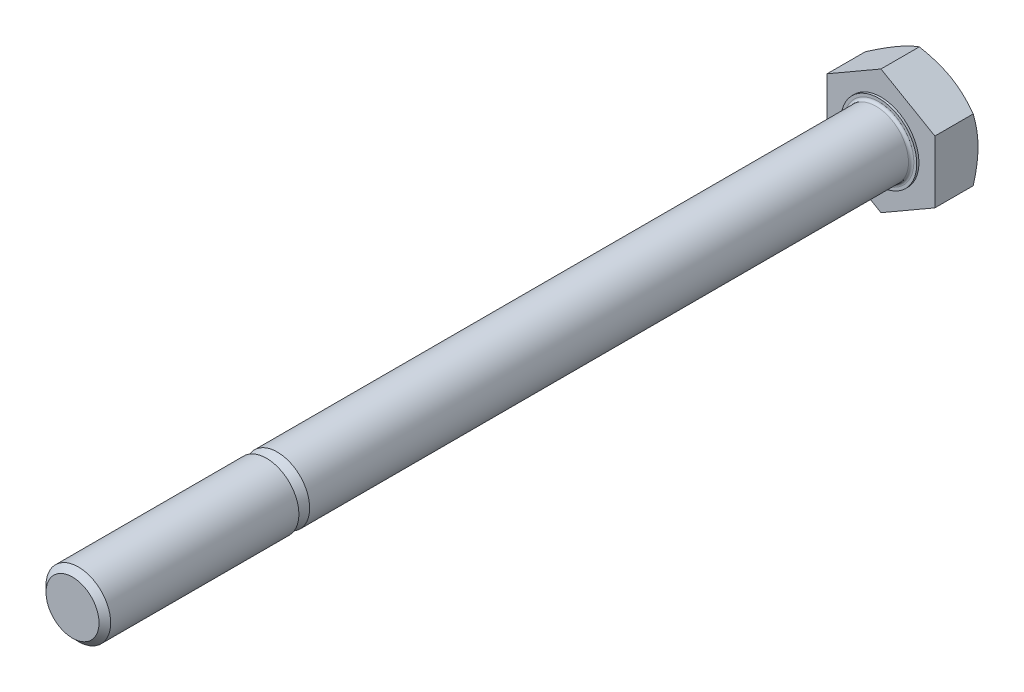
ISO-10303-21;
HEADER;
FILE_DESCRIPTION(('STEP AP214'),'2;1');
FILE_NAME('part.step','',(''),(''),'','','');
FILE_SCHEMA(('AUTOMOTIVE_DESIGN { 1 0 10303 214 1 1 1 1 }'));
ENDSEC;
DATA;
#1=APPLICATION_CONTEXT('core data for automotive mechanical design processes');
#2=APPLICATION_PROTOCOL_DEFINITION('international standard','automotive_design',2000,#1);
#3=PRODUCT_CONTEXT('',#1,'mechanical');
#4=PRODUCT('Part','Part','',(#3));
#5=PRODUCT_RELATED_PRODUCT_CATEGORY('part','',(#4));
#6=PRODUCT_DEFINITION_FORMATION('','',#4);
#7=PRODUCT_DEFINITION_CONTEXT('part definition',#1,'design');
#8=PRODUCT_DEFINITION('design','',#6,#7);
#9=PRODUCT_DEFINITION_SHAPE('','',#8);
#10=(LENGTH_UNIT() NAMED_UNIT(*) SI_UNIT(.MILLI.,.METRE.));
#11=(NAMED_UNIT(*) PLANE_ANGLE_UNIT() SI_UNIT($,.RADIAN.));
#12=(NAMED_UNIT(*) SI_UNIT($,.STERADIAN.) SOLID_ANGLE_UNIT());
#13=UNCERTAINTY_MEASURE_WITH_UNIT(LENGTH_MEASURE(1.E-05),#10,'distance_accuracy_value','');
#14=(GEOMETRIC_REPRESENTATION_CONTEXT(3) GLOBAL_UNCERTAINTY_ASSIGNED_CONTEXT((#13)) GLOBAL_UNIT_ASSIGNED_CONTEXT((#10,
#11,#12)) REPRESENTATION_CONTEXT('',''));
#15=CARTESIAN_POINT('',(0.,0.,0.));
#16=DIRECTION('',(0.,0.,1.));
#17=DIRECTION('',(1.,0.,0.));
#18=AXIS2_PLACEMENT_3D('',#15,#16,#17);
#19=CARTESIAN_POINT('',(5.,-2.88675134594812,-5.));
#20=DIRECTION('',(-0.5,0.866025403784439,0.));
#21=DIRECTION('',(0.866025403784439,0.5,0.));
#22=AXIS2_PLACEMENT_3D('',#19,#20,#21);
#23=PLANE('',#22);
#24=CARTESIAN_POINT('',(5.000002,-2.88675019124759,-3.55341734594793));
#25=CARTESIAN_POINT('',(4.78027074694607,-3.01361208934764,-3.62667401283849));
#26=CARTESIAN_POINT('',(4.5586601198803,-3.14155904453935,-3.69330350087609));
#27=CARTESIAN_POINT('',(4.11160176522467,-3.39966830594325,-3.80960388176341));
#28=CARTESIAN_POINT('',(3.88614609670003,-3.52983519685628,-3.859233638035));
#29=CARTESIAN_POINT('',(3.43799439633442,-3.78857570170015,-3.93647343389728));
#30=CARTESIAN_POINT('',(3.21536814331772,-3.91710902880802,-3.96459799992946));
#31=CARTESIAN_POINT('',(2.8806459561398,-4.11036097367893,-3.98981464288414));
#32=CARTESIAN_POINT('',(2.76899557601673,-4.17482235069811,-3.99539321968897));
#33=CARTESIAN_POINT('',(2.54559174139457,-4.30380461475521,-4.00079886451652));
#34=CARTESIAN_POINT('',(2.43383829018766,-4.36832549989239,-4.00062611028573));
#35=CARTESIAN_POINT('',(2.12769088590962,-4.54507978616402,-3.99223835401767));
#36=CARTESIAN_POINT('',(1.93339845483021,-4.65725457354923,-3.97816111429647));
#37=CARTESIAN_POINT('',(1.54610304420474,-4.88085968312974,-3.93352860367383));
#38=CARTESIAN_POINT('',(1.35310142524446,-4.9922892197905,-3.90295808665975));
#39=CARTESIAN_POINT('',(0.965026180739004,-5.21634456667155,-3.826542206783));
#40=CARTESIAN_POINT('',(0.770001514907567,-5.32894210998795,-3.78037315312653));
#41=CARTESIAN_POINT('',(0.382860131316657,-5.55245829201861,-3.67558875648398));
#42=CARTESIAN_POINT('',(0.190738457644298,-5.66337979203051,-3.61699801824105));
#43=CARTESIAN_POINT('',(-1.9999999993508E-06,-5.7735038465968,-3.55341734594793));
#44=B_SPLINE_CURVE_WITH_KNOTS('',3,(#24,#25,#26,#27,#28,#29,#30,#31,#32,#33,#34,#35,#36,#37,#38,
#39,#40,#41,#42,#43),.UNSPECIFIED.,.F.,.F.,(4,2,2,2,2,2,2,2,2,4),(0.,0.792540187012439,
1.58698486313849,2.36176947896395,2.74878786986339,3.13579429986343,3.80946255620209,
4.48375460996337,5.17299926182492,5.86089121185928),.UNSPECIFIED.);
#45=CARTESIAN_POINT('',(5.,-2.88675134594812,-3.5534180126148));
#46=VERTEX_POINT('',#45);
#47=CARTESIAN_POINT('',(2.5,-4.33012701892219,-4.));
#48=VERTEX_POINT('',#47);
#49=EDGE_CURVE('E131',#46,#48,#44,.T.);
#50=ORIENTED_EDGE('',*,*,#49,.F.);
#51=DIRECTION('',(0.,0.,-1.));
#52=VECTOR('',#51,1.);
#53=CARTESIAN_POINT('',(5.,-2.88675134594812,-2.61479466551195E-09));
#54=LINE('',#53,#52);
#55=CARTESIAN_POINT('',(5.,-2.88675134594812,-2.61479466551195E-09));
#56=VERTEX_POINT('',#55);
#57=EDGE_CURVE('E116',#56,#46,#54,.T.);
#58=ORIENTED_EDGE('',*,*,#57,.F.);
#59=DIRECTION('',(0.866025403784438,0.500000000000001,0.));
#60=VECTOR('',#59,1.);
#61=CARTESIAN_POINT('',(5.,-2.88675134594812,-2.61479466551195E-09));
#62=LINE('',#61,#60);
#63=CARTESIAN_POINT('',(0.,-5.77350269189626,-2.61479466551195E-09));
#64=VERTEX_POINT('',#63);
#65=EDGE_CURVE('E122',#64,#56,#62,.T.);
#66=ORIENTED_EDGE('',*,*,#65,.F.);
#67=DIRECTION('',(0.,0.,-1.));
#68=VECTOR('',#67,1.);
#69=CARTESIAN_POINT('',(0.,-5.77350269189626,-2.61479466551195E-09));
#70=LINE('',#69,#68);
#71=CARTESIAN_POINT('',(0.,-5.77350269189626,-3.55341801261479));
#72=VERTEX_POINT('',#71);
#73=EDGE_CURVE('E239',#64,#72,#70,.T.);
#74=ORIENTED_EDGE('',*,*,#73,.T.);
#75=EDGE_CURVE('E54',#48,#72,#44,.T.);
#76=ORIENTED_EDGE('',*,*,#75,.F.);
#77=EDGE_LOOP('',(#50,#58,#66,#74,#76));
#78=FACE_BOUND('',#77,.T.);
#79=ADVANCED_FACE('F39',(#78),#23,.F.);
#80=CARTESIAN_POINT('',(0.,-5.77350269189626,-5.));
#81=DIRECTION('',(0.5,0.866025403784439,0.));
#82=DIRECTION('',(0.866025403784439,-0.5,0.));
#83=AXIS2_PLACEMENT_3D('',#80,#81,#82);
#84=PLANE('',#83);
#85=CARTESIAN_POINT('',(2.00000000064743E-06,-5.7735038465968,-3.55341734594793));
#86=CARTESIAN_POINT('',(-0.219729253053924,-5.64664194849674,-3.62667401283849));
#87=CARTESIAN_POINT('',(-0.441339880119702,-5.51869499330503,-3.69330350087609));
#88=CARTESIAN_POINT('',(-0.888398234775334,-5.26058573190113,-3.80960388176341));
#89=CARTESIAN_POINT('',(-1.11385390329997,-5.13041884098811,-3.85923363803499));
#90=CARTESIAN_POINT('',(-1.56200560366558,-4.87167833614423,-3.93647343389728));
#91=CARTESIAN_POINT('',(-1.78463185668228,-4.74314500903636,-3.96459799992946));
#92=CARTESIAN_POINT('',(-2.1193540438602,-4.54989306416545,-3.98981464288413));
#93=CARTESIAN_POINT('',(-2.23100442398327,-4.48543168714627,-3.99539321968897));
#94=CARTESIAN_POINT('',(-2.45440825860543,-4.35644942308917,-4.00079886451652));
#95=CARTESIAN_POINT('',(-2.56616170981234,-4.291928537952,-4.00062611028572));
#96=CARTESIAN_POINT('',(-2.87230911409038,-4.11517425168036,-3.99223835401768));
#97=CARTESIAN_POINT('',(-3.06660154516979,-4.00299946429516,-3.97816111429647));
#98=CARTESIAN_POINT('',(-3.45389695579525,-3.77939435471464,-3.93352860367382));
#99=CARTESIAN_POINT('',(-3.64689857475554,-3.66796481805389,-3.90295808665975));
#100=CARTESIAN_POINT('',(-4.03497381926099,-3.44390947117283,-3.826542206783));
#101=CARTESIAN_POINT('',(-4.22999848509243,-3.33131192785644,-3.78037315312652));
#102=CARTESIAN_POINT('',(-4.61713986868334,-3.10779574582578,-3.67558875648398));
#103=CARTESIAN_POINT('',(-4.8092615423557,-2.99687424581388,-3.61699801824105));
#104=CARTESIAN_POINT('',(-5.000002,-2.88675019124759,-3.55341734594793));
#105=B_SPLINE_CURVE_WITH_KNOTS('',3,(#85,#86,#87,#88,#89,#90,#91,#92,#93,#94,#95,#96,#97,#98,
#99,#100,#101,#102,#103,#104),.UNSPECIFIED.,.F.,.F.,(4,2,2,2,2,2,2,2,2,4),(0.,0.792540187012439,
1.58698486313849,2.36176947896395,2.74878786986339,3.13579429986343,3.80946255620209,
4.48375460996337,5.17299926182492,5.86089121185927),.UNSPECIFIED.);
#106=CARTESIAN_POINT('',(-2.5,-4.3301270189222,-4.));
#107=VERTEX_POINT('',#106);
#108=EDGE_CURVE('E181',#72,#107,#105,.T.);
#109=ORIENTED_EDGE('',*,*,#108,.F.);
#110=ORIENTED_EDGE('',*,*,#73,.F.);
#111=DIRECTION('',(0.866025403784439,-0.5,0.));
#112=VECTOR('',#111,1.);
#113=CARTESIAN_POINT('',(0.,-5.77350269189626,-2.61479466551195E-09));
#114=LINE('',#113,#112);
#115=CARTESIAN_POINT('',(-5.,-2.88675134594813,-2.61479466551195E-09));
#116=VERTEX_POINT('',#115);
#117=EDGE_CURVE('E127',#116,#64,#114,.T.);
#118=ORIENTED_EDGE('',*,*,#117,.F.);
#119=DIRECTION('',(0.,0.,-1.));
#120=VECTOR('',#119,1.);
#121=CARTESIAN_POINT('',(-5.,-2.88675134594813,-2.61479466551195E-09));
#122=LINE('',#121,#120);
#123=CARTESIAN_POINT('',(-5.,-2.88675134594813,-3.55341801261479));
#124=VERTEX_POINT('',#123);
#125=EDGE_CURVE('E244',#116,#124,#122,.T.);
#126=ORIENTED_EDGE('',*,*,#125,.T.);
#127=EDGE_CURVE('E62',#107,#124,#105,.T.);
#128=ORIENTED_EDGE('',*,*,#127,.F.);
#129=EDGE_LOOP('',(#109,#110,#118,#126,#128));
#130=FACE_BOUND('',#129,.T.);
#131=ADVANCED_FACE('F231',(#130),#84,.F.);
#132=CARTESIAN_POINT('',(-5.,-2.88675134594813,-5.));
#133=DIRECTION('',(1.,0.,0.));
#134=DIRECTION('',(0.,-1.,0.));
#135=AXIS2_PLACEMENT_3D('',#132,#133,#134);
#136=PLANE('',#135);
#137=CARTESIAN_POINT('',(-5.,7.65620989160719,-1.60730851220314));
#138=CARTESIAN_POINT('',(-5.,7.43668068445187,-1.71339764971142));
#139=CARTESIAN_POINT('',(-5.00000000000001,7.2166324498112,-1.81843220971194));
#140=CARTESIAN_POINT('',(-5.00000000000001,6.775217292149,-2.02578955660455));
#141=CARTESIAN_POINT('',(-5.,6.55385014884432,-2.12811187401153));
#142=CARTESIAN_POINT('',(-5.,6.10832079221154,-2.32998113103873));
#143=CARTESIAN_POINT('',(-5.,5.88414983325619,-2.42950883856025));
#144=CARTESIAN_POINT('',(-5.,5.43396545890422,-2.62428946678928));
#145=CARTESIAN_POINT('',(-5.,5.20795214026934,-2.71954261031161));
#146=CARTESIAN_POINT('',(-5.,4.75091730358843,-2.90576853562678));
#147=CARTESIAN_POINT('',(-5.,4.51986836696229,-2.99667439468201));
#148=CARTESIAN_POINT('',(-5.,4.05504511794165,-3.17136663535019));
#149=CARTESIAN_POINT('',(-5.,3.82127050561654,-3.25515222488515));
#150=CARTESIAN_POINT('',(-5.,3.3511049214154,-3.41335295122633));
#151=CARTESIAN_POINT('',(-5.,3.1147207202618,-3.48778800852407));
#152=CARTESIAN_POINT('',(-5.,2.63858935414024,-3.62486947210752));
#153=CARTESIAN_POINT('',(-5.,2.39884327849118,-3.6875196062624));
#154=CARTESIAN_POINT('',(-5.,1.91583600979795,-3.79799301517174));
#155=CARTESIAN_POINT('',(-5.,1.67257390027251,-3.845812348464));
#156=CARTESIAN_POINT('',(-5.,1.18308256945893,-3.92339260894802));
#157=CARTESIAN_POINT('',(-5.,0.936853345569401,-3.95315352030607));
#158=CARTESIAN_POINT('',(-5.,0.567117593289451,-3.98234325133118));
#159=CARTESIAN_POINT('',(-5.,0.444189898759255,-3.98949936634909));
#160=CARTESIAN_POINT('',(-5.,0.198136128994921,-3.99860265589306));
#161=CARTESIAN_POINT('',(-5.,0.0750100563582885,-4.00054989807679));
#162=CARTESIAN_POINT('',(-5.,-0.171177216207566,-3.99918313774808));
#163=CARTESIAN_POINT('',(-5.,-0.29423842464402,-3.99587061329656));
#164=CARTESIAN_POINT('',(-5.,-0.540114422491311,-3.98406827403109));
#165=CARTESIAN_POINT('',(-5.,-0.662929199152969,-3.97557819794883));
#166=CARTESIAN_POINT('',(-5.,-0.960602635172517,-3.94890221291608));
#167=CARTESIAN_POINT('',(-5.,-1.13523252606317,-3.92812146624754));
#168=CARTESIAN_POINT('',(-5.,-1.48312982453558,-3.87724859224778));
#169=CARTESIAN_POINT('',(-5.,-1.65639704728773,-3.84715522336811));
#170=CARTESIAN_POINT('',(-5.,-2.0014599099285,-3.77872143768563));
#171=CARTESIAN_POINT('',(-5.,-2.17325390132186,-3.74037278751756));
#172=CARTESIAN_POINT('',(-5.,-2.51508012917844,-3.65659803659306));
#173=CARTESIAN_POINT('',(-5.,-2.68511247222647,-3.61117236671524));
#174=CARTESIAN_POINT('',(-5.,-3.02759472997325,-3.51314465542335));
#175=CARTESIAN_POINT('',(-5.,-3.20000183568428,-3.46039407843568));
#176=CARTESIAN_POINT('',(-5.,-3.54299370259063,-3.34968060702553));
#177=CARTESIAN_POINT('',(-5.,-3.71357963115188,-3.29172130765132));
#178=CARTESIAN_POINT('',(-5.,-4.0522446464634,-3.17178761900049));
#179=CARTESIAN_POINT('',(-5.,-4.22033243885282,-3.10983766516145));
#180=CARTESIAN_POINT('',(-5.,-4.55520387372808,-2.98230148307792));
#181=CARTESIAN_POINT('',(-5.,-4.72198695763952,-2.91671378527652));
#182=CARTESIAN_POINT('',(-5.,-4.88816412582649,-2.84966706307693));
#183=B_SPLINE_CURVE_WITH_KNOTS('',3,(#137,#138,#139,#140,#141,#142,#143,#144,#145,#146,#147,
#148,#149,#150,#151,#152,#153,#154,#155,#156,#157,#158,#159,#160,#161,#162,#163,#164,#165,#166,
#167,#168,#169,#170,#171,#172,#173,#174,#175,#176,#177,#178,#179,#180,#181,#182),.UNSPECIFIED.,
.F.,.F.,(4,2,2,2,2,2,2,2,2,2,2,2,2,2,2,2,2,2,2,2,2,2,4),(0.,0.731468501053905,1.46306280212576,
2.19884351250473,2.93458582511369,3.67936259473395,4.42422210717281,5.16746683356835,
5.91047605604178,6.65368257320433,7.39688974201328,7.7662034178799,8.1355122967349,
8.50471741349089,8.87394116252394,9.40123334160666,9.92859584900567,10.456486776027,
10.9843455753877,11.5251349139371,12.0655538262241,12.6029309498223,13.1405267642076),.UNSPECIFIED.);
#184=CARTESIAN_POINT('',(-5.,0.,-4.));
#185=VERTEX_POINT('',#184);
#186=EDGE_CURVE('E225',#124,#185,#183,.F.);
#187=ORIENTED_EDGE('',*,*,#186,.F.);
#188=ORIENTED_EDGE('',*,*,#125,.F.);
#189=DIRECTION('',(0.,-1.,0.));
#190=VECTOR('',#189,1.);
#191=CARTESIAN_POINT('',(-5.,-2.88675134594813,-2.61479466551195E-09));
#192=LINE('',#191,#190);
#193=CARTESIAN_POINT('',(-5.,2.88675134594813,-2.61479466551195E-09));
#194=VERTEX_POINT('',#193);
#195=EDGE_CURVE('E248',#194,#116,#192,.T.);
#196=ORIENTED_EDGE('',*,*,#195,.F.);
#197=DIRECTION('',(0.,0.,-1.));
#198=VECTOR('',#197,1.);
#199=CARTESIAN_POINT('',(-5.,2.88675134594813,-2.61479466551195E-09));
#200=LINE('',#199,#198);
#201=CARTESIAN_POINT('',(-5.,2.88675134594813,-3.55341801261479));
#202=VERTEX_POINT('',#201);
#203=EDGE_CURVE('E246',#194,#202,#200,.T.);
#204=ORIENTED_EDGE('',*,*,#203,.T.);
#205=EDGE_CURVE('E218',#185,#202,#183,.F.);
#206=ORIENTED_EDGE('',*,*,#205,.F.);
#207=EDGE_LOOP('',(#187,#188,#196,#204,#206));
#208=FACE_BOUND('',#207,.T.);
#209=ADVANCED_FACE('F227',(#208),#136,.F.);
#210=CARTESIAN_POINT('',(-5.,2.88675134594813,-5.));
#211=DIRECTION('',(0.5,-0.866025403784439,0.));
#212=DIRECTION('',(-0.866025403784439,-0.5,0.));
#213=AXIS2_PLACEMENT_3D('',#210,#211,#212);
#214=PLANE('',#213);
#215=CARTESIAN_POINT('',(-5.000002,2.88675019124759,-3.55341734594793));
#216=CARTESIAN_POINT('',(-4.78027074694607,3.01361208934765,-3.62667401283849));
#217=CARTESIAN_POINT('',(-4.5586601198803,3.14155904453936,-3.69330350087609));
#218=CARTESIAN_POINT('',(-4.11160176522467,3.39966830594326,-3.80960388176341));
#219=CARTESIAN_POINT('',(-3.88614609670003,3.52983519685628,-3.859233638035));
#220=CARTESIAN_POINT('',(-3.43799439633442,3.78857570170016,-3.93647343389728));
#221=CARTESIAN_POINT('',(-3.21536814331772,3.91710902880803,-3.96459799992946));
#222=CARTESIAN_POINT('',(-2.8806459561398,4.11036097367894,-3.98981464288413));
#223=CARTESIAN_POINT('',(-2.76899557601673,4.17482235069812,-3.99539321968897));
#224=CARTESIAN_POINT('',(-2.54559174139457,4.30380461475522,-4.00079886451652));
#225=CARTESIAN_POINT('',(-2.43383829018766,4.36832549989239,-4.00062611028572));
#226=CARTESIAN_POINT('',(-2.12769088590962,4.54507978616403,-3.99223835401768));
#227=CARTESIAN_POINT('',(-1.93339845483021,4.65725457354923,-3.97816111429647));
#228=CARTESIAN_POINT('',(-1.54610304420475,4.88085968312975,-3.93352860367382));
#229=CARTESIAN_POINT('',(-1.35310142524446,4.9922892197905,-3.90295808665975));
#230=CARTESIAN_POINT('',(-0.965026180739006,5.21634456667156,-3.826542206783));
#231=CARTESIAN_POINT('',(-0.77000151490757,5.32894210998795,-3.78037315312652));
#232=CARTESIAN_POINT('',(-0.38286013131666,5.55245829201861,-3.67558875648398));
#233=CARTESIAN_POINT('',(-0.190738457644301,5.66337979203051,-3.61699801824105));
#234=CARTESIAN_POINT('',(1.99999999749083E-06,5.7735038465968,-3.55341734594793));
#235=B_SPLINE_CURVE_WITH_KNOTS('',3,(#215,#216,#217,#218,#219,#220,#221,#222,#223,#224,#225,
#226,#227,#228,#229,#230,#231,#232,#233,#234),.UNSPECIFIED.,.F.,.F.,(4,2,2,2,2,2,2,2,2,4),(0.,
0.792540187012439,1.58698486313849,2.36176947896395,2.74878786986339,3.13579429986343,
3.80946255620209,4.48375460996337,5.17299926182492,5.86089121185927),.UNSPECIFIED.);
#236=CARTESIAN_POINT('',(-2.5,4.3301270189222,-4.));
#237=VERTEX_POINT('',#236);
#238=EDGE_CURVE('E226',#202,#237,#235,.T.);
#239=ORIENTED_EDGE('',*,*,#238,.F.);
#240=ORIENTED_EDGE('',*,*,#203,.F.);
#241=DIRECTION('',(-0.866025403784439,-0.5,0.));
#242=VECTOR('',#241,1.);
#243=CARTESIAN_POINT('',(-5.,2.88675134594813,-2.61479466551195E-09));
#244=LINE('',#243,#242);
#245=CARTESIAN_POINT('',(0.,5.77350269189626,-2.61479466551195E-09));
#246=VERTEX_POINT('',#245);
#247=EDGE_CURVE('E260',#246,#194,#244,.T.);
#248=ORIENTED_EDGE('',*,*,#247,.F.);
#249=DIRECTION('',(0.,0.,-1.));
#250=VECTOR('',#249,1.);
#251=CARTESIAN_POINT('',(0.,5.77350269189626,-2.61479466551195E-09));
#252=LINE('',#251,#250);
#253=CARTESIAN_POINT('',(0.,5.77350269189626,-3.55341801261479));
#254=VERTEX_POINT('',#253);
#255=EDGE_CURVE('E140',#246,#254,#252,.T.);
#256=ORIENTED_EDGE('',*,*,#255,.T.);
#257=EDGE_CURVE('E212',#237,#254,#235,.T.);
#258=ORIENTED_EDGE('',*,*,#257,.F.);
#259=EDGE_LOOP('',(#239,#240,#248,#256,#258));
#260=FACE_BOUND('',#259,.T.);
#261=ADVANCED_FACE('F230',(#260),#214,.F.);
#262=CARTESIAN_POINT('',(0.,5.77350269189626,-5.));
#263=DIRECTION('',(-0.5,-0.866025403784439,0.));
#264=DIRECTION('',(-0.866025403784439,0.5,0.));
#265=AXIS2_PLACEMENT_3D('',#262,#263,#264);
#266=PLANE('',#265);
#267=CARTESIAN_POINT('',(-2.00000000176389E-06,5.7735038465968,-3.55341734594793));
#268=CARTESIAN_POINT('',(0.219729253053923,5.64664194849674,-3.62667401283849));
#269=CARTESIAN_POINT('',(0.441339880119701,5.51869499330503,-3.69330350087608));
#270=CARTESIAN_POINT('',(0.888398234775333,5.26058573190113,-3.80960388176341));
#271=CARTESIAN_POINT('',(1.11385390329997,5.13041884098811,-3.85923363803499));
#272=CARTESIAN_POINT('',(1.56200560366558,4.87167833614423,-3.93647343389727));
#273=CARTESIAN_POINT('',(1.78463185668228,4.74314500903636,-3.96459799992946));
#274=CARTESIAN_POINT('',(2.1193540438602,4.54989306416545,-3.98981464288413));
#275=CARTESIAN_POINT('',(2.23100442398327,4.48543168714627,-3.99539321968896));
#276=CARTESIAN_POINT('',(2.45440825860543,4.35644942308917,-4.00079886451652));
#277=CARTESIAN_POINT('',(2.56616170981234,4.291928537952,-4.00062611028572));
#278=CARTESIAN_POINT('',(2.87230911409038,4.11517425168036,-3.99223835401768));
#279=CARTESIAN_POINT('',(3.06660154516979,4.00299946429516,-3.97816111429647));
#280=CARTESIAN_POINT('',(3.45389695579525,3.77939435471464,-3.93352860367382));
#281=CARTESIAN_POINT('',(3.64689857475554,3.66796481805389,-3.90295808665975));
#282=CARTESIAN_POINT('',(4.03497381926099,3.44390947117283,-3.826542206783));
#283=CARTESIAN_POINT('',(4.22999848509243,3.33131192785644,-3.78037315312652));
#284=CARTESIAN_POINT('',(4.61713986868334,3.10779574582578,-3.67558875648398));
#285=CARTESIAN_POINT('',(4.8092615423557,2.99687424581388,-3.61699801824105));
#286=CARTESIAN_POINT('',(5.000002,2.88675019124759,-3.55341734594793));
#287=B_SPLINE_CURVE_WITH_KNOTS('',3,(#267,#268,#269,#270,#271,#272,#273,#274,#275,#276,#277,
#278,#279,#280,#281,#282,#283,#284,#285,#286),.UNSPECIFIED.,.F.,.F.,(4,2,2,2,2,2,2,2,2,4),(0.,
0.792540187012439,1.58698486313849,2.36176947896395,2.74878786986339,3.13579429986343,
3.80946255620209,4.48375460996337,5.17299926182492,5.86089121185927),.UNSPECIFIED.);
#288=CARTESIAN_POINT('',(2.5,4.3301270189222,-4.));
#289=VERTEX_POINT('',#288);
#290=EDGE_CURVE('E264',#254,#289,#287,.T.);
#291=ORIENTED_EDGE('',*,*,#290,.F.);
#292=ORIENTED_EDGE('',*,*,#255,.F.);
#293=DIRECTION('',(-0.866025403784439,0.5,0.));
#294=VECTOR('',#293,1.);
#295=CARTESIAN_POINT('',(0.,5.77350269189626,-2.61479466551195E-09));
#296=LINE('',#295,#294);
#297=CARTESIAN_POINT('',(5.,2.88675134594813,-2.61479466551195E-09));
#298=VERTEX_POINT('',#297);
#299=EDGE_CURVE('E121',#298,#246,#296,.T.);
#300=ORIENTED_EDGE('',*,*,#299,.F.);
#301=DIRECTION('',(0.,0.,-1.));
#302=VECTOR('',#301,1.);
#303=CARTESIAN_POINT('',(5.,2.88675134594813,-2.61479466551195E-09));
#304=LINE('',#303,#302);
#305=CARTESIAN_POINT('',(5.,2.88675134594813,-3.55341801261479));
#306=VERTEX_POINT('',#305);
#307=EDGE_CURVE('E118',#298,#306,#304,.T.);
#308=ORIENTED_EDGE('',*,*,#307,.T.);
#309=EDGE_CURVE('E147',#289,#306,#287,.T.);
#310=ORIENTED_EDGE('',*,*,#309,.F.);
#311=EDGE_LOOP('',(#291,#292,#300,#308,#310));
#312=FACE_BOUND('',#311,.T.);
#313=ADVANCED_FACE('F262',(#312),#266,.F.);
#314=CARTESIAN_POINT('',(5.,2.88675134594813,-5.));
#315=DIRECTION('',(-1.,0.,0.));
#316=DIRECTION('',(0.,1.,0.));
#317=AXIS2_PLACEMENT_3D('',#314,#315,#316);
#318=PLANE('',#317);
#319=CARTESIAN_POINT('',(5.,7.6562098916072,-1.60730851220314));
#320=CARTESIAN_POINT('',(5.,7.43668068445188,-1.71339764971142));
#321=CARTESIAN_POINT('',(5.,7.21663244981121,-1.81843220971194));
#322=CARTESIAN_POINT('',(5.,6.77521729214901,-2.02578955660455));
#323=CARTESIAN_POINT('',(5.,6.55385014884433,-2.12811187401152));
#324=CARTESIAN_POINT('',(5.,6.10832079221155,-2.32998113103873));
#325=CARTESIAN_POINT('',(5.,5.8841498332562,-2.42950883856025));
#326=CARTESIAN_POINT('',(5.,5.43396545890423,-2.62428946678928));
#327=CARTESIAN_POINT('',(5.,5.20795214026935,-2.71954261031161));
#328=CARTESIAN_POINT('',(5.,4.75091730358844,-2.90576853562678));
#329=CARTESIAN_POINT('',(5.,4.51986836696229,-2.99667439468201));
#330=CARTESIAN_POINT('',(5.,4.05504511794166,-3.17136663535019));
#331=CARTESIAN_POINT('',(5.,3.82127050561655,-3.25515222488515));
#332=CARTESIAN_POINT('',(5.,3.3511049214154,-3.41335295122633));
#333=CARTESIAN_POINT('',(5.,3.1147207202618,-3.48778800852407));
#334=CARTESIAN_POINT('',(5.,2.63858935414024,-3.62486947210752));
#335=CARTESIAN_POINT('',(5.,2.39884327849118,-3.6875196062624));
#336=CARTESIAN_POINT('',(5.,1.91583600979795,-3.79799301517174));
#337=CARTESIAN_POINT('',(5.,1.67257390027251,-3.845812348464));
#338=CARTESIAN_POINT('',(5.,1.18308256945893,-3.92339260894802));
#339=CARTESIAN_POINT('',(5.,0.936853345569402,-3.95315352030607));
#340=CARTESIAN_POINT('',(5.,0.567117593289452,-3.98234325133118));
#341=CARTESIAN_POINT('',(5.,0.444189898759256,-3.98949936634909));
#342=CARTESIAN_POINT('',(5.,0.198136128994923,-3.99860265589306));
#343=CARTESIAN_POINT('',(5.,0.0750100563582902,-4.00054989807679));
#344=CARTESIAN_POINT('',(5.,-0.171177216207564,-3.99918313774808));
#345=CARTESIAN_POINT('',(5.,-0.294238424644018,-3.99587061329656));
#346=CARTESIAN_POINT('',(5.,-0.540114422491308,-3.98406827403109));
#347=CARTESIAN_POINT('',(5.,-0.662929199152966,-3.97557819794883));
#348=CARTESIAN_POINT('',(5.,-0.960602635172513,-3.94890221291608));
#349=CARTESIAN_POINT('',(5.,-1.13523252606317,-3.92812146624754));
#350=CARTESIAN_POINT('',(5.,-1.48312982453558,-3.87724859224778));
#351=CARTESIAN_POINT('',(5.,-1.65639704728773,-3.84715522336811));
#352=CARTESIAN_POINT('',(5.,-2.0014599099285,-3.77872143768562));
#353=CARTESIAN_POINT('',(5.,-2.17325390132186,-3.74037278751756));
#354=CARTESIAN_POINT('',(5.,-2.51508012917844,-3.65659803659306));
#355=CARTESIAN_POINT('',(5.,-2.68511247222647,-3.61117236671524));
#356=CARTESIAN_POINT('',(5.,-3.02759472997325,-3.51314465542335));
#357=CARTESIAN_POINT('',(5.,-3.20000183568428,-3.46039407843568));
#358=CARTESIAN_POINT('',(5.,-3.54299370259063,-3.34968060702553));
#359=CARTESIAN_POINT('',(5.,-3.71357963115188,-3.29172130765132));
#360=CARTESIAN_POINT('',(5.,-4.0522446464634,-3.17178761900049));
#361=CARTESIAN_POINT('',(5.00000000000001,-4.22033243885282,-3.10983766516145));
#362=CARTESIAN_POINT('',(5.00000000000001,-4.55520387372808,-2.98230148307792));
#363=CARTESIAN_POINT('',(5.,-4.72198695763952,-2.91671378527652));
#364=CARTESIAN_POINT('',(5.,-4.88816412582649,-2.84966706307693));
#365=B_SPLINE_CURVE_WITH_KNOTS('',3,(#319,#320,#321,#322,#323,#324,#325,#326,#327,#328,#329,
#330,#331,#332,#333,#334,#335,#336,#337,#338,#339,#340,#341,#342,#343,#344,#345,#346,#347,#348,
#349,#350,#351,#352,#353,#354,#355,#356,#357,#358,#359,#360,#361,#362,#363,#364),.UNSPECIFIED.,
.F.,.F.,(4,2,2,2,2,2,2,2,2,2,2,2,2,2,2,2,2,2,2,2,2,2,4),(0.,0.731468501053904,1.46306280212576,
2.19884351250473,2.93458582511369,3.67936259473395,4.42422210717282,5.16746683356836,
5.91047605604179,6.65368257320434,7.39688974201329,7.76620341787991,8.13551229673491,
8.5047174134909,8.87394116252395,9.40123334160666,9.92859584900567,10.456486776027,
10.9843455753877,11.5251349139371,12.0655538262241,12.6029309498223,13.1405267642076),.UNSPECIFIED.);
#366=CARTESIAN_POINT('',(5.,0.,-4.));
#367=VERTEX_POINT('',#366);
#368=EDGE_CURVE('E313',#306,#367,#365,.T.);
#369=ORIENTED_EDGE('',*,*,#368,.F.);
#370=ORIENTED_EDGE('',*,*,#307,.F.);
#371=DIRECTION('',(0.,1.,0.));
#372=VECTOR('',#371,1.);
#373=CARTESIAN_POINT('',(5.,2.88675134594813,-2.61479466551195E-09));
#374=LINE('',#373,#372);
#375=EDGE_CURVE('E112',#56,#298,#374,.T.);
#376=ORIENTED_EDGE('',*,*,#375,.F.);
#377=ORIENTED_EDGE('',*,*,#57,.T.);
#378=EDGE_CURVE('E188',#367,#46,#365,.T.);
#379=ORIENTED_EDGE('',*,*,#378,.F.);
#380=EDGE_LOOP('',(#369,#370,#376,#377,#379));
#381=FACE_BOUND('',#380,.T.);
#382=ADVANCED_FACE('F114',(#381),#318,.F.);
#383=CARTESIAN_POINT('',(0.,0.,-3.55255354137804));
#384=DIRECTION('',(0.,0.,1.));
#385=DIRECTION('',(-1.,0.,0.));
#386=AXIS2_PLACEMENT_3D('',#383,#384,#385);
#387=CONICAL_SURFACE('',#386,5.775,1.0471975511966);
#388=CARTESIAN_POINT('',(0.,0.,-4.));
#389=DIRECTION('',(0.,0.,1.));
#390=DIRECTION('',(-1.,0.,0.));
#391=AXIS2_PLACEMENT_3D('',#388,#389,#390);
#392=CIRCLE('',#391,5.);
#393=EDGE_CURVE('E148',#107,#48,#392,.T.);
#394=ORIENTED_EDGE('',*,*,#393,.T.);
#395=ORIENTED_EDGE('',*,*,#75,.T.);
#396=ORIENTED_EDGE('',*,*,#108,.T.);
#397=EDGE_LOOP('',(#394,#395,#396));
#398=FACE_BOUND('',#397,.T.);
#399=ADVANCED_FACE('F203',(#398),#387,.T.);
#400=EDGE_CURVE('E753',#367,#289,#392,.T.);
#401=ORIENTED_EDGE('',*,*,#400,.T.);
#402=ORIENTED_EDGE('',*,*,#309,.T.);
#403=ORIENTED_EDGE('',*,*,#368,.T.);
#404=EDGE_LOOP('',(#401,#402,#403));
#405=FACE_BOUND('',#404,.T.);
#406=ADVANCED_FACE('F204',(#405),#387,.T.);
#407=EDGE_CURVE('E137',#289,#237,#392,.T.);
#408=ORIENTED_EDGE('',*,*,#407,.T.);
#409=ORIENTED_EDGE('',*,*,#257,.T.);
#410=ORIENTED_EDGE('',*,*,#290,.T.);
#411=EDGE_LOOP('',(#408,#409,#410));
#412=FACE_BOUND('',#411,.T.);
#413=ADVANCED_FACE('F270',(#412),#387,.T.);
#414=EDGE_CURVE('E133',#237,#185,#392,.T.);
#415=ORIENTED_EDGE('',*,*,#414,.T.);
#416=ORIENTED_EDGE('',*,*,#205,.T.);
#417=ORIENTED_EDGE('',*,*,#238,.T.);
#418=EDGE_LOOP('',(#415,#416,#417));
#419=FACE_BOUND('',#418,.T.);
#420=ADVANCED_FACE('F279',(#419),#387,.T.);
#421=EDGE_CURVE('E139',#185,#107,#392,.T.);
#422=ORIENTED_EDGE('',*,*,#421,.T.);
#423=ORIENTED_EDGE('',*,*,#127,.T.);
#424=ORIENTED_EDGE('',*,*,#186,.T.);
#425=EDGE_LOOP('',(#422,#423,#424));
#426=FACE_BOUND('',#425,.T.);
#427=ADVANCED_FACE('F287',(#426),#387,.T.);
#428=CARTESIAN_POINT('',(0.,-5.,-4.));
#429=DIRECTION('',(0.,0.,-1.));
#430=DIRECTION('',(1.,0.,0.));
#431=AXIS2_PLACEMENT_3D('',#428,#429,#430);
#432=PLANE('',#431);
#433=ORIENTED_EDGE('',*,*,#421,.F.);
#434=ORIENTED_EDGE('',*,*,#414,.F.);
#435=ORIENTED_EDGE('',*,*,#407,.F.);
#436=ORIENTED_EDGE('',*,*,#400,.F.);
#437=EDGE_CURVE('E757',#48,#367,#392,.T.);
#438=ORIENTED_EDGE('',*,*,#437,.F.);
#439=ORIENTED_EDGE('',*,*,#393,.F.);
#440=EDGE_LOOP('',(#433,#434,#435,#436,#438,#439));
#441=FACE_BOUND('',#440,.T.);
#442=ADVANCED_FACE('F201',(#441),#432,.T.);
#443=ORIENTED_EDGE('',*,*,#378,.T.);
#444=ORIENTED_EDGE('',*,*,#49,.T.);
#445=ORIENTED_EDGE('',*,*,#437,.T.);
#446=EDGE_LOOP('',(#443,#444,#445));
#447=FACE_BOUND('',#446,.T.);
#448=ADVANCED_FACE('F197',(#447),#387,.T.);
#449=CARTESIAN_POINT('',(0.,-5.77350269189626,-2.61479466551195E-09));
#450=DIRECTION('',(0.,0.,-1.));
#451=DIRECTION('',(-1.,0.,0.));
#452=AXIS2_PLACEMENT_3D('',#449,#450,#451);
#453=PLANE('',#452);
#454=CARTESIAN_POINT('',(0.,0.,0.));
#455=DIRECTION('',(0.,0.,-1.));
#456=DIRECTION('',(-1.,0.,0.));
#457=AXIS2_PLACEMENT_3D('',#454,#455,#456);
#458=CIRCLE('',#457,3.5203013293146);
#459=CARTESIAN_POINT('',(-3.5203013293146,0.,0.));
#460=VERTEX_POINT('',#459);
#461=EDGE_CURVE('E129',#460,#460,#458,.T.);
#462=ORIENTED_EDGE('',*,*,#461,.T.);
#463=EDGE_LOOP('',(#462));
#464=FACE_BOUND('',#463,.T.);
#465=ORIENTED_EDGE('',*,*,#65,.T.);
#466=ORIENTED_EDGE('',*,*,#375,.T.);
#467=ORIENTED_EDGE('',*,*,#299,.T.);
#468=ORIENTED_EDGE('',*,*,#247,.T.);
#469=ORIENTED_EDGE('',*,*,#195,.T.);
#470=ORIENTED_EDGE('',*,*,#117,.T.);
#471=EDGE_LOOP('',(#465,#466,#467,#468,#469,#470));
#472=FACE_BOUND('',#471,.T.);
#473=ADVANCED_FACE('F125',(#464,#472),#453,.F.);
#474=CARTESIAN_POINT('',(0.,0.,75.));
#475=DIRECTION('',(0.,0.,-1.));
#476=DIRECTION('',(-1.,0.,0.));
#477=AXIS2_PLACEMENT_3D('',#474,#475,#476);
#478=CYLINDRICAL_SURFACE('',#477,3.00000000000001);
#479=CARTESIAN_POINT('',(0.,0.,74.45875));
#480=DIRECTION('',(0.,0.,1.));
#481=DIRECTION('',(1.,0.,0.));
#482=AXIS2_PLACEMENT_3D('',#479,#480,#481);
#483=CIRCLE('',#482,3.00000000000001);
#484=CARTESIAN_POINT('',(3.00000000000001,0.,74.45875));
#485=VERTEX_POINT('',#484);
#486=EDGE_CURVE('E320',#485,#485,#483,.F.);
#487=ORIENTED_EDGE('',*,*,#486,.T.);
#488=EDGE_LOOP('',(#487));
#489=FACE_BOUND('',#488,.T.);
#490=CARTESIAN_POINT('',(0.,0.,57.));
#491=DIRECTION('',(0.,0.,-1.));
#492=DIRECTION('',(-1.,0.,0.));
#493=AXIS2_PLACEMENT_3D('',#490,#491,#492);
#494=CIRCLE('',#493,3.00000000000001);
#495=CARTESIAN_POINT('',(-3.00000000000001,0.,57.));
#496=VERTEX_POINT('',#495);
#497=EDGE_CURVE('E545',#496,#496,#494,.T.);
#498=ORIENTED_EDGE('',*,*,#497,.F.);
#499=EDGE_LOOP('',(#498));
#500=FACE_BOUND('',#499,.T.);
#501=ADVANCED_FACE('F442',(#489,#500),#478,.T.);
#502=CARTESIAN_POINT('',(3.00000000000001,0.,75.));
#503=DIRECTION('',(0.,0.,1.));
#504=DIRECTION('',(1.,0.,0.));
#505=AXIS2_PLACEMENT_3D('',#502,#503,#504);
#506=PLANE('',#505);
#507=CARTESIAN_POINT('',(0.,0.,75.));
#508=DIRECTION('',(0.,0.,1.));
#509=DIRECTION('',(1.,0.,0.));
#510=AXIS2_PLACEMENT_3D('',#507,#508,#509);
#511=CIRCLE('',#510,2.45875);
#512=CARTESIAN_POINT('',(2.45875,0.,75.));
#513=VERTEX_POINT('',#512);
#514=EDGE_CURVE('E536',#513,#513,#511,.T.);
#515=ORIENTED_EDGE('',*,*,#514,.T.);
#516=EDGE_LOOP('',(#515));
#517=FACE_BOUND('',#516,.T.);
#518=ADVANCED_FACE('F455',(#517),#506,.T.);
#519=CARTESIAN_POINT('',(0.,0.,75.));
#520=DIRECTION('',(0.,0.,-1.));
#521=DIRECTION('',(-1.,0.,0.));
#522=AXIS2_PLACEMENT_3D('',#519,#520,#521);
#523=CYLINDRICAL_SURFACE('',#522,3.5203013293146);
#524=CARTESIAN_POINT('',(0.,0.,0.200000000000006));
#525=DIRECTION('',(0.,0.,-1.));
#526=DIRECTION('',(-1.,0.,0.));
#527=AXIS2_PLACEMENT_3D('',#524,#525,#526);
#528=CIRCLE('',#527,3.5203013293146);
#529=CARTESIAN_POINT('',(-3.5203013293146,0.,0.200000000000006));
#530=VERTEX_POINT('',#529);
#531=EDGE_CURVE('E554',#530,#530,#528,.T.);
#532=ORIENTED_EDGE('',*,*,#531,.T.);
#533=EDGE_LOOP('',(#532));
#534=FACE_BOUND('',#533,.T.);
#535=ORIENTED_EDGE('',*,*,#461,.F.);
#536=EDGE_LOOP('',(#535));
#537=FACE_BOUND('',#536,.T.);
#538=ADVANCED_FACE('F449',(#534,#537),#523,.T.);
#539=CARTESIAN_POINT('',(3.5203013293146,0.,0.2));
#540=DIRECTION('',(0.,0.,1.));
#541=DIRECTION('',(1.,0.,0.));
#542=AXIS2_PLACEMENT_3D('',#539,#540,#541);
#543=PLANE('',#542);
#544=CARTESIAN_POINT('',(0.,0.,0.2));
#545=DIRECTION('',(0.,0.,1.));
#546=DIRECTION('',(1.,0.,0.));
#547=AXIS2_PLACEMENT_3D('',#544,#545,#546);
#548=CIRCLE('',#547,3.25000000000001);
#549=CARTESIAN_POINT('',(3.25000000000001,0.,0.2));
#550=VERTEX_POINT('',#549);
#551=EDGE_CURVE('E47',#550,#550,#548,.F.);
#552=ORIENTED_EDGE('',*,*,#551,.T.);
#553=EDGE_LOOP('',(#552));
#554=FACE_BOUND('',#553,.T.);
#555=ORIENTED_EDGE('',*,*,#531,.F.);
#556=EDGE_LOOP('',(#555));
#557=FACE_BOUND('',#556,.T.);
#558=ADVANCED_FACE('F454',(#554,#557),#543,.T.);
#559=CARTESIAN_POINT('',(0.,0.,75.));
#560=DIRECTION('',(0.,0.,-1.));
#561=DIRECTION('',(-1.,0.,0.));
#562=AXIS2_PLACEMENT_3D('',#559,#560,#561);
#563=CYLINDRICAL_SURFACE('',#562,3.00000000000001);
#564=CARTESIAN_POINT('',(0.,0.,0.450000000000006));
#565=DIRECTION('',(0.,0.,1.));
#566=DIRECTION('',(1.,0.,0.));
#567=AXIS2_PLACEMENT_3D('',#564,#565,#566);
#568=CIRCLE('',#567,3.00000000000001);
#569=CARTESIAN_POINT('',(3.00000000000001,0.,0.450000000000006));
#570=VERTEX_POINT('',#569);
#571=EDGE_CURVE('E12',#570,#570,#568,.T.);
#572=ORIENTED_EDGE('',*,*,#571,.T.);
#573=EDGE_LOOP('',(#572));
#574=FACE_BOUND('',#573,.T.);
#575=CARTESIAN_POINT('',(0.,0.,56.));
#576=DIRECTION('',(0.,0.,-1.));
#577=DIRECTION('',(-1.,0.,0.));
#578=AXIS2_PLACEMENT_3D('',#575,#576,#577);
#579=CIRCLE('',#578,3.00000000000001);
#580=CARTESIAN_POINT('',(-3.00000000000001,0.,56.));
#581=VERTEX_POINT('',#580);
#582=EDGE_CURVE('E549',#581,#581,#579,.T.);
#583=ORIENTED_EDGE('',*,*,#582,.T.);
#584=EDGE_LOOP('',(#583));
#585=FACE_BOUND('',#584,.T.);
#586=ADVANCED_FACE('F471',(#574,#585),#563,.T.);
#587=CARTESIAN_POINT('',(0.,0.,56.));
#588=DIRECTION('',(0.,0.,-1.));
#589=DIRECTION('',(-1.,0.,0.));
#590=AXIS2_PLACEMENT_3D('',#587,#588,#589);
#591=CONICAL_SURFACE('',#590,3.00000000000001,0.352022972542047);
#592=CARTESIAN_POINT('',(0.,0.,57.));
#593=DIRECTION('',(0.,0.,-1.));
#594=DIRECTION('',(-1.,0.,0.));
#595=AXIS2_PLACEMENT_3D('',#592,#593,#594);
#596=CIRCLE('',#595,2.63267728274741);
#597=CARTESIAN_POINT('',(-2.63267728274741,0.,57.));
#598=VERTEX_POINT('',#597);
#599=EDGE_CURVE('E546',#598,#598,#596,.T.);
#600=ORIENTED_EDGE('',*,*,#599,.T.);
#601=EDGE_LOOP('',(#600));
#602=FACE_BOUND('',#601,.T.);
#603=ORIENTED_EDGE('',*,*,#582,.F.);
#604=EDGE_LOOP('',(#603));
#605=FACE_BOUND('',#604,.T.);
#606=ADVANCED_FACE('F465',(#602,#605),#591,.T.);
#607=CARTESIAN_POINT('',(2.63267728274741,0.,57.));
#608=DIRECTION('',(0.,0.,-1.));
#609=DIRECTION('',(-1.,0.,0.));
#610=AXIS2_PLACEMENT_3D('',#607,#608,#609);
#611=PLANE('',#610);
#612=ORIENTED_EDGE('',*,*,#497,.T.);
#613=EDGE_LOOP('',(#612));
#614=FACE_BOUND('',#613,.T.);
#615=ORIENTED_EDGE('',*,*,#599,.F.);
#616=EDGE_LOOP('',(#615));
#617=FACE_BOUND('',#616,.T.);
#618=ADVANCED_FACE('F470',(#614,#617),#611,.T.);
#619=CARTESIAN_POINT('',(0.,0.,74.45875));
#620=DIRECTION('',(0.,0.,-1.));
#621=DIRECTION('',(-1.,0.,0.));
#622=AXIS2_PLACEMENT_3D('',#619,#620,#621);
#623=CONICAL_SURFACE('',#622,3.00000000000001,0.785398163397449);
#624=ORIENTED_EDGE('',*,*,#514,.F.);
#625=EDGE_LOOP('',(#624));
#626=FACE_BOUND('',#625,.T.);
#627=ORIENTED_EDGE('',*,*,#486,.F.);
#628=EDGE_LOOP('',(#627));
#629=FACE_BOUND('',#628,.T.);
#630=ADVANCED_FACE('F483',(#626,#629),#623,.T.);
#631=CARTESIAN_POINT('',(0.,0.,0.450000000000006));
#632=DIRECTION('',(0.,0.,1.));
#633=DIRECTION('',(1.,0.,0.));
#634=AXIS2_PLACEMENT_3D('',#631,#632,#633);
#635=TOROIDAL_SURFACE('',#634,3.25000000000001,0.25);
#636=ORIENTED_EDGE('',*,*,#571,.F.);
#637=EDGE_LOOP('',(#636));
#638=FACE_BOUND('',#637,.T.);
#639=ORIENTED_EDGE('',*,*,#551,.F.);
#640=EDGE_LOOP('',(#639));
#641=FACE_BOUND('',#640,.T.);
#642=ADVANCED_FACE('F41',(#638,#641),#635,.F.);
#643=CLOSED_SHELL('',(#79,#131,#209,#261,#313,#382,#399,#406,#413,#420,#427,#442,#448,#473,#501,
#518,#538,#558,#586,#606,#618,#630,#642));
#644=MANIFOLD_SOLID_BREP('B2',#643);
#645=ADVANCED_BREP_SHAPE_REPRESENTATION('',(#18,#644),#14);
#646=SHAPE_DEFINITION_REPRESENTATION(#9,#645);
ENDSEC;
END-ISO-10303-21;
